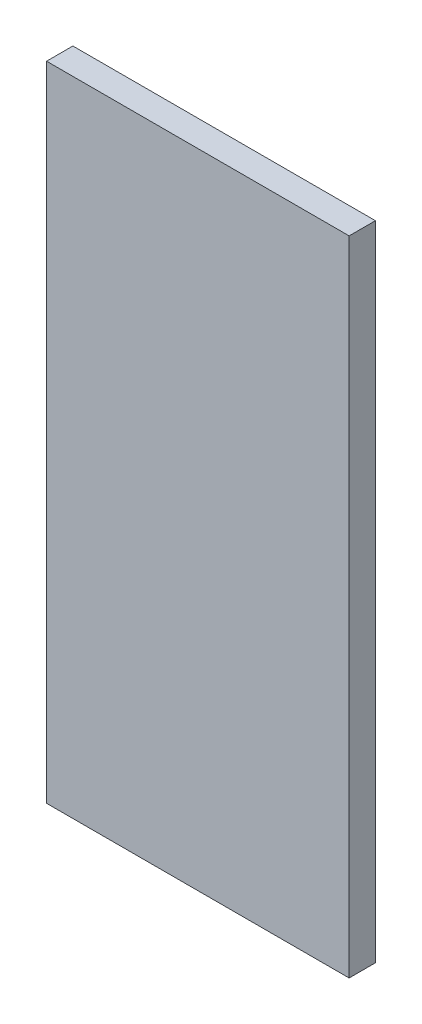
ISO-10303-21;
HEADER;
FILE_DESCRIPTION(('STEP AP214'),'2;1');
FILE_NAME('part.step','',(''),(''),'','','');
FILE_SCHEMA(('AUTOMOTIVE_DESIGN { 1 0 10303 214 1 1 1 1 }'));
ENDSEC;
DATA;
#1=APPLICATION_CONTEXT('core data for automotive mechanical design processes');
#2=APPLICATION_PROTOCOL_DEFINITION('international standard','automotive_design',2000,#1);
#3=PRODUCT_CONTEXT('',#1,'mechanical');
#4=PRODUCT('Part','Part','',(#3));
#5=PRODUCT_RELATED_PRODUCT_CATEGORY('part','',(#4));
#6=PRODUCT_DEFINITION_FORMATION('','',#4);
#7=PRODUCT_DEFINITION_CONTEXT('part definition',#1,'design');
#8=PRODUCT_DEFINITION('design','',#6,#7);
#9=PRODUCT_DEFINITION_SHAPE('','',#8);
#10=(LENGTH_UNIT() NAMED_UNIT(*) SI_UNIT(.MILLI.,.METRE.));
#11=(NAMED_UNIT(*) PLANE_ANGLE_UNIT() SI_UNIT($,.RADIAN.));
#12=(NAMED_UNIT(*) SI_UNIT($,.STERADIAN.) SOLID_ANGLE_UNIT());
#13=UNCERTAINTY_MEASURE_WITH_UNIT(LENGTH_MEASURE(1.E-05),#10,'distance_accuracy_value','');
#14=(GEOMETRIC_REPRESENTATION_CONTEXT(3) GLOBAL_UNCERTAINTY_ASSIGNED_CONTEXT((#13)) GLOBAL_UNIT_ASSIGNED_CONTEXT((#10,
#11,#12)) REPRESENTATION_CONTEXT('',''));
#15=CARTESIAN_POINT('',(0.,0.,0.));
#16=DIRECTION('',(0.,0.,1.));
#17=DIRECTION('',(1.,0.,0.));
#18=AXIS2_PLACEMENT_3D('',#15,#16,#17);
#19=CARTESIAN_POINT('',(80.5,171.,14.));
#20=DIRECTION('',(-1.,0.,0.));
#21=DIRECTION('',(0.,-1.,0.));
#22=AXIS2_PLACEMENT_3D('',#19,#20,#21);
#23=PLANE('',#22);
#24=DIRECTION('',(0.,1.,0.));
#25=VECTOR('',#24,1.);
#26=CARTESIAN_POINT('',(80.5,171.,0.));
#27=LINE('',#26,#25);
#28=CARTESIAN_POINT('',(80.5,-171.,0.));
#29=VERTEX_POINT('',#28);
#30=CARTESIAN_POINT('',(80.5,171.,0.));
#31=VERTEX_POINT('',#30);
#32=EDGE_CURVE('E100',#29,#31,#27,.T.);
#33=ORIENTED_EDGE('',*,*,#32,.T.);
#34=DIRECTION('',(0.,0.,-1.));
#35=VECTOR('',#34,1.);
#36=CARTESIAN_POINT('',(80.5,171.,14.));
#37=LINE('',#36,#35);
#38=CARTESIAN_POINT('',(80.5,171.,14.));
#39=VERTEX_POINT('',#38);
#40=EDGE_CURVE('E11',#39,#31,#37,.T.);
#41=ORIENTED_EDGE('',*,*,#40,.F.);
#42=DIRECTION('',(0.,1.,0.));
#43=VECTOR('',#42,1.);
#44=CARTESIAN_POINT('',(80.5,171.,14.));
#45=LINE('',#44,#43);
#46=CARTESIAN_POINT('',(80.5,-171.,14.));
#47=VERTEX_POINT('',#46);
#48=EDGE_CURVE('E88',#47,#39,#45,.T.);
#49=ORIENTED_EDGE('',*,*,#48,.F.);
#50=DIRECTION('',(0.,0.,-1.));
#51=VECTOR('',#50,1.);
#52=CARTESIAN_POINT('',(80.5,-171.,14.));
#53=LINE('',#52,#51);
#54=EDGE_CURVE('E96',#47,#29,#53,.T.);
#55=ORIENTED_EDGE('',*,*,#54,.T.);
#56=EDGE_LOOP('',(#33,#41,#49,#55));
#57=FACE_BOUND('',#56,.T.);
#58=ADVANCED_FACE('F37',(#57),#23,.F.);
#59=CARTESIAN_POINT('',(-80.5,171.,14.));
#60=DIRECTION('',(0.,-1.,0.));
#61=DIRECTION('',(0.,0.,-1.));
#62=AXIS2_PLACEMENT_3D('',#59,#60,#61);
#63=PLANE('',#62);
#64=DIRECTION('',(-1.,0.,0.));
#65=VECTOR('',#64,1.);
#66=CARTESIAN_POINT('',(-80.5,171.,0.));
#67=LINE('',#66,#65);
#68=CARTESIAN_POINT('',(-80.5,171.,0.));
#69=VERTEX_POINT('',#68);
#70=EDGE_CURVE('E92',#31,#69,#67,.T.);
#71=ORIENTED_EDGE('',*,*,#70,.T.);
#72=DIRECTION('',(0.,0.,-1.));
#73=VECTOR('',#72,1.);
#74=CARTESIAN_POINT('',(-80.5,171.,14.));
#75=LINE('',#74,#73);
#76=CARTESIAN_POINT('',(-80.5,171.,14.));
#77=VERTEX_POINT('',#76);
#78=EDGE_CURVE('E45',#77,#69,#75,.T.);
#79=ORIENTED_EDGE('',*,*,#78,.F.);
#80=DIRECTION('',(-1.,0.,0.));
#81=VECTOR('',#80,1.);
#82=CARTESIAN_POINT('',(-80.5,171.,14.));
#83=LINE('',#82,#81);
#84=EDGE_CURVE('E83',#39,#77,#83,.T.);
#85=ORIENTED_EDGE('',*,*,#84,.F.);
#86=ORIENTED_EDGE('',*,*,#40,.T.);
#87=EDGE_LOOP('',(#71,#79,#85,#86));
#88=FACE_BOUND('',#87,.T.);
#89=ADVANCED_FACE('F91',(#88),#63,.F.);
#90=CARTESIAN_POINT('',(-80.5,171.,14.));
#91=DIRECTION('',(1.,0.,0.));
#92=DIRECTION('',(0.,1.,0.));
#93=AXIS2_PLACEMENT_3D('',#90,#91,#92);
#94=PLANE('',#93);
#95=DIRECTION('',(0.,-1.,0.));
#96=VECTOR('',#95,1.);
#97=CARTESIAN_POINT('',(-80.5,171.,0.));
#98=LINE('',#97,#96);
#99=CARTESIAN_POINT('',(-80.5,-171.,0.));
#100=VERTEX_POINT('',#99);
#101=EDGE_CURVE('E70',#69,#100,#98,.T.);
#102=ORIENTED_EDGE('',*,*,#101,.T.);
#103=DIRECTION('',(0.,0.,-1.));
#104=VECTOR('',#103,1.);
#105=CARTESIAN_POINT('',(-80.5,-171.,14.));
#106=LINE('',#105,#104);
#107=CARTESIAN_POINT('',(-80.5,-171.,14.));
#108=VERTEX_POINT('',#107);
#109=EDGE_CURVE('E93',#108,#100,#106,.T.);
#110=ORIENTED_EDGE('',*,*,#109,.F.);
#111=DIRECTION('',(0.,-1.,0.));
#112=VECTOR('',#111,1.);
#113=CARTESIAN_POINT('',(-80.5,171.,14.));
#114=LINE('',#113,#112);
#115=EDGE_CURVE('E86',#77,#108,#114,.T.);
#116=ORIENTED_EDGE('',*,*,#115,.F.);
#117=ORIENTED_EDGE('',*,*,#78,.T.);
#118=EDGE_LOOP('',(#102,#110,#116,#117));
#119=FACE_BOUND('',#118,.T.);
#120=ADVANCED_FACE('F94',(#119),#94,.F.);
#121=CARTESIAN_POINT('',(-80.5,-171.,14.));
#122=DIRECTION('',(0.,1.,0.));
#123=DIRECTION('',(0.,0.,1.));
#124=AXIS2_PLACEMENT_3D('',#121,#122,#123);
#125=PLANE('',#124);
#126=DIRECTION('',(1.,0.,0.));
#127=VECTOR('',#126,1.);
#128=CARTESIAN_POINT('',(-80.5,-171.,0.));
#129=LINE('',#128,#127);
#130=EDGE_CURVE('E76',#100,#29,#129,.T.);
#131=ORIENTED_EDGE('',*,*,#130,.T.);
#132=ORIENTED_EDGE('',*,*,#54,.F.);
#133=DIRECTION('',(1.,0.,0.));
#134=VECTOR('',#133,1.);
#135=CARTESIAN_POINT('',(-80.5,-171.,14.));
#136=LINE('',#135,#134);
#137=EDGE_CURVE('E53',#108,#47,#136,.T.);
#138=ORIENTED_EDGE('',*,*,#137,.F.);
#139=ORIENTED_EDGE('',*,*,#109,.T.);
#140=EDGE_LOOP('',(#131,#132,#138,#139));
#141=FACE_BOUND('',#140,.T.);
#142=ADVANCED_FACE('F107',(#141),#125,.F.);
#143=CARTESIAN_POINT('',(0.,0.,14.));
#144=DIRECTION('',(0.,0.,1.));
#145=DIRECTION('',(1.,0.,0.));
#146=AXIS2_PLACEMENT_3D('',#143,#144,#145);
#147=PLANE('',#146);
#148=ORIENTED_EDGE('',*,*,#48,.T.);
#149=ORIENTED_EDGE('',*,*,#84,.T.);
#150=ORIENTED_EDGE('',*,*,#115,.T.);
#151=ORIENTED_EDGE('',*,*,#137,.T.);
#152=EDGE_LOOP('',(#148,#149,#150,#151));
#153=FACE_BOUND('',#152,.T.);
#154=ADVANCED_FACE('F84',(#153),#147,.T.);
#155=CARTESIAN_POINT('',(0.,0.,0.));
#156=DIRECTION('',(0.,0.,1.));
#157=DIRECTION('',(1.,0.,0.));
#158=AXIS2_PLACEMENT_3D('',#155,#156,#157);
#159=PLANE('',#158);
#160=ORIENTED_EDGE('',*,*,#32,.F.);
#161=ORIENTED_EDGE('',*,*,#130,.F.);
#162=ORIENTED_EDGE('',*,*,#101,.F.);
#163=ORIENTED_EDGE('',*,*,#70,.F.);
#164=EDGE_LOOP('',(#160,#161,#162,#163));
#165=FACE_BOUND('',#164,.T.);
#166=ADVANCED_FACE('F110',(#165),#159,.F.);
#167=CLOSED_SHELL('',(#58,#89,#120,#142,#154,#166));
#168=MANIFOLD_SOLID_BREP('B2',#167);
#169=ADVANCED_BREP_SHAPE_REPRESENTATION('',(#18,#168),#14);
#170=SHAPE_DEFINITION_REPRESENTATION(#9,#169);
ENDSEC;
END-ISO-10303-21;
